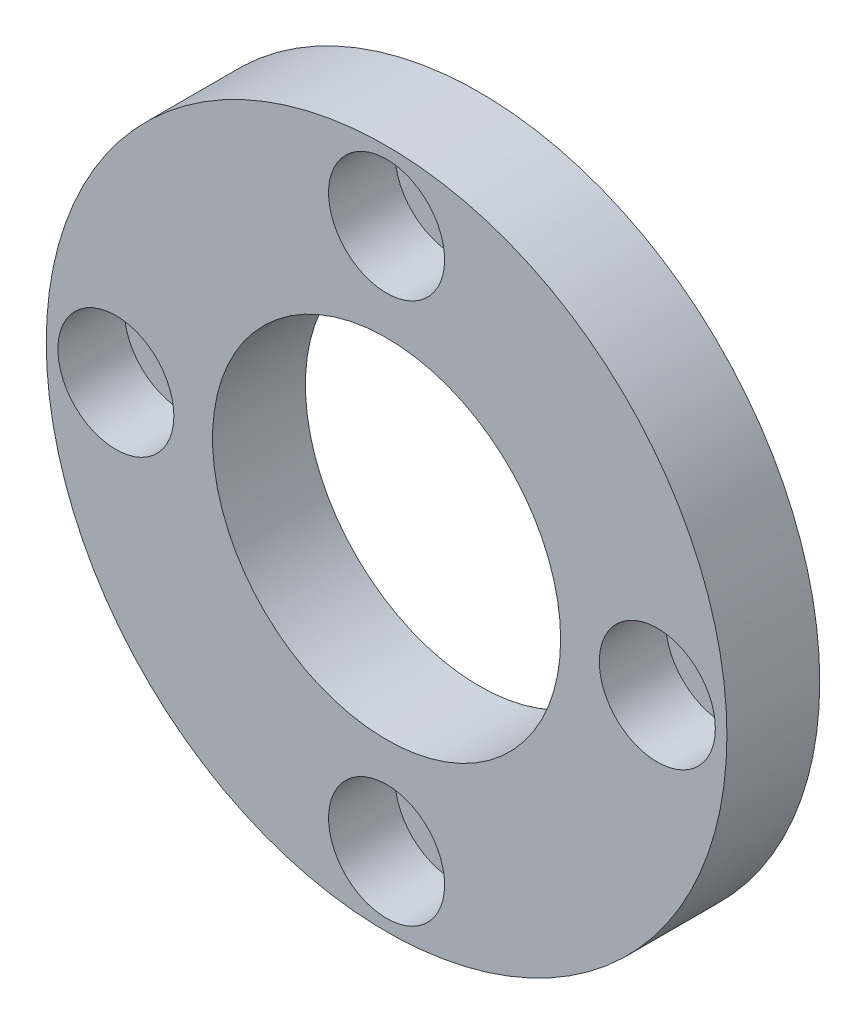
ISO-10303-21;
HEADER;
FILE_DESCRIPTION(('STEP AP214'),'2;1');
FILE_NAME('part.step','',(''),(''),'','','');
FILE_SCHEMA(('AUTOMOTIVE_DESIGN { 1 0 10303 214 1 1 1 1 }'));
ENDSEC;
DATA;
#1=APPLICATION_CONTEXT('core data for automotive mechanical design processes');
#2=APPLICATION_PROTOCOL_DEFINITION('international standard','automotive_design',2000,#1);
#3=PRODUCT_CONTEXT('',#1,'mechanical');
#4=PRODUCT('Part','Part','',(#3));
#5=PRODUCT_RELATED_PRODUCT_CATEGORY('part','',(#4));
#6=PRODUCT_DEFINITION_FORMATION('','',#4);
#7=PRODUCT_DEFINITION_CONTEXT('part definition',#1,'design');
#8=PRODUCT_DEFINITION('design','',#6,#7);
#9=PRODUCT_DEFINITION_SHAPE('','',#8);
#10=(LENGTH_UNIT() NAMED_UNIT(*) SI_UNIT(.MILLI.,.METRE.));
#11=(NAMED_UNIT(*) PLANE_ANGLE_UNIT() SI_UNIT($,.RADIAN.));
#12=(NAMED_UNIT(*) SI_UNIT($,.STERADIAN.) SOLID_ANGLE_UNIT());
#13=UNCERTAINTY_MEASURE_WITH_UNIT(LENGTH_MEASURE(1.E-05),#10,'distance_accuracy_value','');
#14=(GEOMETRIC_REPRESENTATION_CONTEXT(3) GLOBAL_UNCERTAINTY_ASSIGNED_CONTEXT((#13)) GLOBAL_UNIT_ASSIGNED_CONTEXT((#10,
#11,#12)) REPRESENTATION_CONTEXT('',''));
#15=CARTESIAN_POINT('',(0.,0.,0.));
#16=DIRECTION('',(0.,0.,1.));
#17=DIRECTION('',(1.,0.,0.));
#18=AXIS2_PLACEMENT_3D('',#15,#16,#17);
#19=CARTESIAN_POINT('',(0.,0.,12.));
#20=DIRECTION('',(0.,0.,1.));
#21=DIRECTION('',(1.,0.,0.));
#22=AXIS2_PLACEMENT_3D('',#19,#20,#21);
#23=PLANE('',#22);
#24=CARTESIAN_POINT('',(0.,-34.9999999999995,12.));
#25=DIRECTION('',(0.,0.,1.));
#26=DIRECTION('',(1.,0.,0.));
#27=AXIS2_PLACEMENT_3D('',#24,#25,#26);
#28=CIRCLE('',#27,7.5);
#29=CARTESIAN_POINT('',(7.50000000000006,-34.9999999999995,12.));
#30=VERTEX_POINT('',#29);
#31=EDGE_CURVE('E121',#30,#30,#28,.T.);
#32=ORIENTED_EDGE('',*,*,#31,.F.);
#33=EDGE_LOOP('',(#32));
#34=FACE_BOUND('',#33,.T.);
#35=CARTESIAN_POINT('',(-34.9999999999999,0.,12.));
#36=DIRECTION('',(0.,0.,1.));
#37=DIRECTION('',(1.,0.,0.));
#38=AXIS2_PLACEMENT_3D('',#35,#36,#37);
#39=CIRCLE('',#38,7.5);
#40=CARTESIAN_POINT('',(-27.4999999999999,0.,12.));
#41=VERTEX_POINT('',#40);
#42=EDGE_CURVE('E77',#41,#41,#39,.T.);
#43=ORIENTED_EDGE('',*,*,#42,.F.);
#44=EDGE_LOOP('',(#43));
#45=FACE_BOUND('',#44,.T.);
#46=CARTESIAN_POINT('',(0.,35.0000000000005,12.));
#47=DIRECTION('',(0.,0.,1.));
#48=DIRECTION('',(1.,0.,0.));
#49=AXIS2_PLACEMENT_3D('',#46,#47,#48);
#50=CIRCLE('',#49,7.5);
#51=CARTESIAN_POINT('',(7.50000000000006,35.0000000000005,12.));
#52=VERTEX_POINT('',#51);
#53=EDGE_CURVE('E64',#52,#52,#50,.T.);
#54=ORIENTED_EDGE('',*,*,#53,.F.);
#55=EDGE_LOOP('',(#54));
#56=FACE_BOUND('',#55,.T.);
#57=CARTESIAN_POINT('',(35.0000000000001,3.34151908649102E-13,12.));
#58=DIRECTION('',(0.,0.,1.));
#59=DIRECTION('',(1.,0.,0.));
#60=AXIS2_PLACEMENT_3D('',#57,#58,#59);
#61=CIRCLE('',#60,7.49999999999999);
#62=CARTESIAN_POINT('',(42.5000000000001,3.34151908649102E-13,12.));
#63=VERTEX_POINT('',#62);
#64=EDGE_CURVE('E60',#63,#63,#61,.T.);
#65=ORIENTED_EDGE('',*,*,#64,.F.);
#66=EDGE_LOOP('',(#65));
#67=FACE_BOUND('',#66,.T.);
#68=CARTESIAN_POINT('',(0.,0.,12.));
#69=DIRECTION('',(0.,0.,1.));
#70=DIRECTION('',(1.,0.,0.));
#71=AXIS2_PLACEMENT_3D('',#68,#69,#70);
#72=CIRCLE('',#71,44.);
#73=CARTESIAN_POINT('',(44.,0.,12.));
#74=VERTEX_POINT('',#73);
#75=EDGE_CURVE('E10',#74,#74,#72,.T.);
#76=ORIENTED_EDGE('',*,*,#75,.T.);
#77=EDGE_LOOP('',(#76));
#78=FACE_BOUND('',#77,.T.);
#79=CARTESIAN_POINT('',(0.,0.,12.));
#80=DIRECTION('',(0.,0.,1.));
#81=DIRECTION('',(1.,0.,0.));
#82=AXIS2_PLACEMENT_3D('',#79,#80,#81);
#83=CIRCLE('',#82,22.5);
#84=CARTESIAN_POINT('',(22.5,0.,12.));
#85=VERTEX_POINT('',#84);
#86=EDGE_CURVE('E48',#85,#85,#83,.T.);
#87=ORIENTED_EDGE('',*,*,#86,.F.);
#88=EDGE_LOOP('',(#87));
#89=FACE_BOUND('',#88,.T.);
#90=ADVANCED_FACE('F35',(#34,#45,#56,#67,#78,#89),#23,.T.);
#91=CARTESIAN_POINT('',(0.,0.,0.));
#92=DIRECTION('',(0.,0.,1.));
#93=DIRECTION('',(1.,0.,0.));
#94=AXIS2_PLACEMENT_3D('',#91,#92,#93);
#95=PLANE('',#94);
#96=CARTESIAN_POINT('',(0.,-34.9999999999995,0.));
#97=DIRECTION('',(0.,0.,1.));
#98=DIRECTION('',(1.,0.,0.));
#99=AXIS2_PLACEMENT_3D('',#96,#97,#98);
#100=CIRCLE('',#99,4.49999999999999);
#101=CARTESIAN_POINT('',(4.50000000000006,-34.9999999999995,0.));
#102=VERTEX_POINT('',#101);
#103=EDGE_CURVE('E39',#102,#102,#100,.T.);
#104=ORIENTED_EDGE('',*,*,#103,.T.);
#105=EDGE_LOOP('',(#104));
#106=FACE_BOUND('',#105,.T.);
#107=CARTESIAN_POINT('',(-34.9999999999999,0.,0.));
#108=DIRECTION('',(0.,0.,1.));
#109=DIRECTION('',(1.,0.,0.));
#110=AXIS2_PLACEMENT_3D('',#107,#108,#109);
#111=CIRCLE('',#110,4.5);
#112=CARTESIAN_POINT('',(-30.4999999999999,0.,0.));
#113=VERTEX_POINT('',#112);
#114=EDGE_CURVE('E62',#113,#113,#111,.T.);
#115=ORIENTED_EDGE('',*,*,#114,.T.);
#116=EDGE_LOOP('',(#115));
#117=FACE_BOUND('',#116,.T.);
#118=CARTESIAN_POINT('',(0.,35.0000000000005,0.));
#119=DIRECTION('',(0.,0.,1.));
#120=DIRECTION('',(1.,0.,0.));
#121=AXIS2_PLACEMENT_3D('',#118,#119,#120);
#122=CIRCLE('',#121,4.49999999999999);
#123=CARTESIAN_POINT('',(4.50000000000006,35.0000000000005,0.));
#124=VERTEX_POINT('',#123);
#125=EDGE_CURVE('E58',#124,#124,#122,.T.);
#126=ORIENTED_EDGE('',*,*,#125,.T.);
#127=EDGE_LOOP('',(#126));
#128=FACE_BOUND('',#127,.T.);
#129=CARTESIAN_POINT('',(35.0000000000001,3.34151908649102E-13,0.));
#130=DIRECTION('',(0.,0.,1.));
#131=DIRECTION('',(1.,0.,0.));
#132=AXIS2_PLACEMENT_3D('',#129,#130,#131);
#133=CIRCLE('',#132,4.49999999999999);
#134=CARTESIAN_POINT('',(39.5000000000001,3.34151908649102E-13,0.));
#135=VERTEX_POINT('',#134);
#136=EDGE_CURVE('E54',#135,#135,#133,.T.);
#137=ORIENTED_EDGE('',*,*,#136,.T.);
#138=EDGE_LOOP('',(#137));
#139=FACE_BOUND('',#138,.T.);
#140=CARTESIAN_POINT('',(0.,0.,0.));
#141=DIRECTION('',(0.,0.,1.));
#142=DIRECTION('',(1.,0.,0.));
#143=AXIS2_PLACEMENT_3D('',#140,#141,#142);
#144=CIRCLE('',#143,44.);
#145=CARTESIAN_POINT('',(44.,0.,0.));
#146=VERTEX_POINT('',#145);
#147=EDGE_CURVE('E43',#146,#146,#144,.T.);
#148=ORIENTED_EDGE('',*,*,#147,.F.);
#149=EDGE_LOOP('',(#148));
#150=FACE_BOUND('',#149,.T.);
#151=CARTESIAN_POINT('',(0.,0.,0.));
#152=DIRECTION('',(0.,0.,1.));
#153=DIRECTION('',(1.,0.,0.));
#154=AXIS2_PLACEMENT_3D('',#151,#152,#153);
#155=CIRCLE('',#154,22.5);
#156=CARTESIAN_POINT('',(22.5,0.,0.));
#157=VERTEX_POINT('',#156);
#158=EDGE_CURVE('E51',#157,#157,#155,.T.);
#159=ORIENTED_EDGE('',*,*,#158,.T.);
#160=EDGE_LOOP('',(#159));
#161=FACE_BOUND('',#160,.T.);
#162=ADVANCED_FACE('F97',(#106,#117,#128,#139,#150,#161),#95,.F.);
#163=CARTESIAN_POINT('',(0.,0.,12.));
#164=DIRECTION('',(0.,0.,-1.));
#165=DIRECTION('',(-1.,0.,0.));
#166=AXIS2_PLACEMENT_3D('',#163,#164,#165);
#167=CYLINDRICAL_SURFACE('',#166,44.);
#168=ORIENTED_EDGE('',*,*,#75,.F.);
#169=EDGE_LOOP('',(#168));
#170=FACE_BOUND('',#169,.T.);
#171=ORIENTED_EDGE('',*,*,#147,.T.);
#172=EDGE_LOOP('',(#171));
#173=FACE_BOUND('',#172,.T.);
#174=ADVANCED_FACE('F37',(#170,#173),#167,.T.);
#175=CARTESIAN_POINT('',(0.,0.,12.));
#176=DIRECTION('',(0.,0.,-1.));
#177=DIRECTION('',(-1.,0.,0.));
#178=AXIS2_PLACEMENT_3D('',#175,#176,#177);
#179=CYLINDRICAL_SURFACE('',#178,22.5);
#180=ORIENTED_EDGE('',*,*,#86,.T.);
#181=EDGE_LOOP('',(#180));
#182=FACE_BOUND('',#181,.T.);
#183=ORIENTED_EDGE('',*,*,#158,.F.);
#184=EDGE_LOOP('',(#183));
#185=FACE_BOUND('',#184,.T.);
#186=ADVANCED_FACE('F99',(#182,#185),#179,.F.);
#187=CARTESIAN_POINT('',(35.0000000000001,3.34151908649102E-13,12.));
#188=DIRECTION('',(0.,0.,1.));
#189=DIRECTION('',(1.,0.,0.));
#190=AXIS2_PLACEMENT_3D('',#187,#188,#189);
#191=CYLINDRICAL_SURFACE('',#190,4.49999999999999);
#192=CARTESIAN_POINT('',(35.0000000000001,3.34151908649102E-13,3.4));
#193=DIRECTION('',(0.,0.,1.));
#194=DIRECTION('',(1.,0.,0.));
#195=AXIS2_PLACEMENT_3D('',#192,#193,#194);
#196=CIRCLE('',#195,4.5);
#197=CARTESIAN_POINT('',(39.5000000000001,3.34151908649102E-13,3.4));
#198=VERTEX_POINT('',#197);
#199=EDGE_CURVE('E57',#198,#198,#196,.T.);
#200=ORIENTED_EDGE('',*,*,#199,.T.);
#201=EDGE_LOOP('',(#200));
#202=FACE_BOUND('',#201,.T.);
#203=ORIENTED_EDGE('',*,*,#136,.F.);
#204=EDGE_LOOP('',(#203));
#205=FACE_BOUND('',#204,.T.);
#206=ADVANCED_FACE('F101',(#202,#205),#191,.F.);
#207=CARTESIAN_POINT('',(39.5000000000001,3.34151908649102E-13,3.4));
#208=DIRECTION('',(0.,0.,-1.));
#209=DIRECTION('',(-1.,0.,0.));
#210=AXIS2_PLACEMENT_3D('',#207,#208,#209);
#211=PLANE('',#210);
#212=ORIENTED_EDGE('',*,*,#199,.F.);
#213=EDGE_LOOP('',(#212));
#214=FACE_BOUND('',#213,.T.);
#215=CARTESIAN_POINT('',(35.0000000000001,3.34151908649102E-13,3.4));
#216=DIRECTION('',(0.,0.,1.));
#217=DIRECTION('',(1.,0.,0.));
#218=AXIS2_PLACEMENT_3D('',#215,#216,#217);
#219=CIRCLE('',#218,7.49999999999999);
#220=CARTESIAN_POINT('',(42.5000000000001,3.34151908649102E-13,3.4));
#221=VERTEX_POINT('',#220);
#222=EDGE_CURVE('E87',#221,#221,#219,.T.);
#223=ORIENTED_EDGE('',*,*,#222,.T.);
#224=EDGE_LOOP('',(#223));
#225=FACE_BOUND('',#224,.T.);
#226=ADVANCED_FACE('F107',(#214,#225),#211,.F.);
#227=CARTESIAN_POINT('',(35.0000000000001,3.34151908649102E-13,12.));
#228=DIRECTION('',(0.,0.,1.));
#229=DIRECTION('',(1.,0.,0.));
#230=AXIS2_PLACEMENT_3D('',#227,#228,#229);
#231=CYLINDRICAL_SURFACE('',#230,7.49999999999999);
#232=ORIENTED_EDGE('',*,*,#222,.F.);
#233=EDGE_LOOP('',(#232));
#234=FACE_BOUND('',#233,.T.);
#235=ORIENTED_EDGE('',*,*,#64,.T.);
#236=EDGE_LOOP('',(#235));
#237=FACE_BOUND('',#236,.T.);
#238=ADVANCED_FACE('F130',(#234,#237),#231,.F.);
#239=CARTESIAN_POINT('',(0.,35.0000000000005,12.));
#240=DIRECTION('',(0.,0.,1.));
#241=DIRECTION('',(1.,0.,0.));
#242=AXIS2_PLACEMENT_3D('',#239,#240,#241);
#243=CYLINDRICAL_SURFACE('',#242,4.49999999999999);
#244=CARTESIAN_POINT('',(0.,35.0000000000005,3.4));
#245=DIRECTION('',(0.,0.,1.));
#246=DIRECTION('',(1.,0.,0.));
#247=AXIS2_PLACEMENT_3D('',#244,#245,#246);
#248=CIRCLE('',#247,4.5);
#249=CARTESIAN_POINT('',(4.50000000000006,35.0000000000005,3.4));
#250=VERTEX_POINT('',#249);
#251=EDGE_CURVE('E61',#250,#250,#248,.T.);
#252=ORIENTED_EDGE('',*,*,#251,.T.);
#253=EDGE_LOOP('',(#252));
#254=FACE_BOUND('',#253,.T.);
#255=ORIENTED_EDGE('',*,*,#125,.F.);
#256=EDGE_LOOP('',(#255));
#257=FACE_BOUND('',#256,.T.);
#258=ADVANCED_FACE('F132',(#254,#257),#243,.F.);
#259=CARTESIAN_POINT('',(4.50000000000006,35.0000000000005,3.4));
#260=DIRECTION('',(0.,0.,-1.));
#261=DIRECTION('',(-1.,0.,0.));
#262=AXIS2_PLACEMENT_3D('',#259,#260,#261);
#263=PLANE('',#262);
#264=ORIENTED_EDGE('',*,*,#251,.F.);
#265=EDGE_LOOP('',(#264));
#266=FACE_BOUND('',#265,.T.);
#267=CARTESIAN_POINT('',(0.,35.0000000000005,3.4));
#268=DIRECTION('',(0.,0.,1.));
#269=DIRECTION('',(1.,0.,0.));
#270=AXIS2_PLACEMENT_3D('',#267,#268,#269);
#271=CIRCLE('',#270,7.5);
#272=CARTESIAN_POINT('',(7.50000000000006,35.0000000000005,3.4));
#273=VERTEX_POINT('',#272);
#274=EDGE_CURVE('E69',#273,#273,#271,.T.);
#275=ORIENTED_EDGE('',*,*,#274,.T.);
#276=EDGE_LOOP('',(#275));
#277=FACE_BOUND('',#276,.T.);
#278=ADVANCED_FACE('F139',(#266,#277),#263,.F.);
#279=CARTESIAN_POINT('',(0.,35.0000000000005,12.));
#280=DIRECTION('',(0.,0.,1.));
#281=DIRECTION('',(1.,0.,0.));
#282=AXIS2_PLACEMENT_3D('',#279,#280,#281);
#283=CYLINDRICAL_SURFACE('',#282,7.5);
#284=ORIENTED_EDGE('',*,*,#274,.F.);
#285=EDGE_LOOP('',(#284));
#286=FACE_BOUND('',#285,.T.);
#287=ORIENTED_EDGE('',*,*,#53,.T.);
#288=EDGE_LOOP('',(#287));
#289=FACE_BOUND('',#288,.T.);
#290=ADVANCED_FACE('F148',(#286,#289),#283,.F.);
#291=CARTESIAN_POINT('',(-34.9999999999999,0.,12.));
#292=DIRECTION('',(0.,0.,1.));
#293=DIRECTION('',(1.,0.,0.));
#294=AXIS2_PLACEMENT_3D('',#291,#292,#293);
#295=CYLINDRICAL_SURFACE('',#294,4.5);
#296=CARTESIAN_POINT('',(-34.9999999999999,0.,3.4));
#297=DIRECTION('',(0.,0.,1.));
#298=DIRECTION('',(1.,0.,0.));
#299=AXIS2_PLACEMENT_3D('',#296,#297,#298);
#300=CIRCLE('',#299,4.5);
#301=CARTESIAN_POINT('',(-30.4999999999999,0.,3.4));
#302=VERTEX_POINT('',#301);
#303=EDGE_CURVE('E65',#302,#302,#300,.T.);
#304=ORIENTED_EDGE('',*,*,#303,.T.);
#305=EDGE_LOOP('',(#304));
#306=FACE_BOUND('',#305,.T.);
#307=ORIENTED_EDGE('',*,*,#114,.F.);
#308=EDGE_LOOP('',(#307));
#309=FACE_BOUND('',#308,.T.);
#310=ADVANCED_FACE('F152',(#306,#309),#295,.F.);
#311=CARTESIAN_POINT('',(-30.4999999999999,0.,3.4));
#312=DIRECTION('',(0.,0.,-1.));
#313=DIRECTION('',(-1.,0.,0.));
#314=AXIS2_PLACEMENT_3D('',#311,#312,#313);
#315=PLANE('',#314);
#316=ORIENTED_EDGE('',*,*,#303,.F.);
#317=EDGE_LOOP('',(#316));
#318=FACE_BOUND('',#317,.T.);
#319=CARTESIAN_POINT('',(-34.9999999999999,0.,3.4));
#320=DIRECTION('',(0.,0.,1.));
#321=DIRECTION('',(1.,0.,0.));
#322=AXIS2_PLACEMENT_3D('',#319,#320,#321);
#323=CIRCLE('',#322,7.5);
#324=CARTESIAN_POINT('',(-27.4999999999999,0.,3.4));
#325=VERTEX_POINT('',#324);
#326=EDGE_CURVE('E72',#325,#325,#323,.T.);
#327=ORIENTED_EDGE('',*,*,#326,.T.);
#328=EDGE_LOOP('',(#327));
#329=FACE_BOUND('',#328,.T.);
#330=ADVANCED_FACE('F156',(#318,#329),#315,.F.);
#331=CARTESIAN_POINT('',(-34.9999999999999,0.,12.));
#332=DIRECTION('',(0.,0.,1.));
#333=DIRECTION('',(1.,0.,0.));
#334=AXIS2_PLACEMENT_3D('',#331,#332,#333);
#335=CYLINDRICAL_SURFACE('',#334,7.5);
#336=ORIENTED_EDGE('',*,*,#326,.F.);
#337=EDGE_LOOP('',(#336));
#338=FACE_BOUND('',#337,.T.);
#339=ORIENTED_EDGE('',*,*,#42,.T.);
#340=EDGE_LOOP('',(#339));
#341=FACE_BOUND('',#340,.T.);
#342=ADVANCED_FACE('F159',(#338,#341),#335,.F.);
#343=CARTESIAN_POINT('',(0.,-34.9999999999995,12.));
#344=DIRECTION('',(0.,0.,1.));
#345=DIRECTION('',(1.,0.,0.));
#346=AXIS2_PLACEMENT_3D('',#343,#344,#345);
#347=CYLINDRICAL_SURFACE('',#346,4.49999999999999);
#348=CARTESIAN_POINT('',(0.,-34.9999999999995,3.4));
#349=DIRECTION('',(0.,0.,1.));
#350=DIRECTION('',(1.,0.,0.));
#351=AXIS2_PLACEMENT_3D('',#348,#349,#350);
#352=CIRCLE('',#351,4.5);
#353=CARTESIAN_POINT('',(4.50000000000006,-34.9999999999995,3.4));
#354=VERTEX_POINT('',#353);
#355=EDGE_CURVE('E182',#354,#354,#352,.T.);
#356=ORIENTED_EDGE('',*,*,#355,.T.);
#357=EDGE_LOOP('',(#356));
#358=FACE_BOUND('',#357,.T.);
#359=ORIENTED_EDGE('',*,*,#103,.F.);
#360=EDGE_LOOP('',(#359));
#361=FACE_BOUND('',#360,.T.);
#362=ADVANCED_FACE('F163',(#358,#361),#347,.F.);
#363=CARTESIAN_POINT('',(4.50000000000006,-34.9999999999995,3.4));
#364=DIRECTION('',(0.,0.,-1.));
#365=DIRECTION('',(-1.,0.,0.));
#366=AXIS2_PLACEMENT_3D('',#363,#364,#365);
#367=PLANE('',#366);
#368=ORIENTED_EDGE('',*,*,#355,.F.);
#369=EDGE_LOOP('',(#368));
#370=FACE_BOUND('',#369,.T.);
#371=CARTESIAN_POINT('',(0.,-34.9999999999995,3.4));
#372=DIRECTION('',(0.,0.,1.));
#373=DIRECTION('',(1.,0.,0.));
#374=AXIS2_PLACEMENT_3D('',#371,#372,#373);
#375=CIRCLE('',#374,7.5);
#376=CARTESIAN_POINT('',(7.50000000000006,-34.9999999999995,3.4));
#377=VERTEX_POINT('',#376);
#378=EDGE_CURVE('E180',#377,#377,#375,.T.);
#379=ORIENTED_EDGE('',*,*,#378,.T.);
#380=EDGE_LOOP('',(#379));
#381=FACE_BOUND('',#380,.T.);
#382=ADVANCED_FACE('F167',(#370,#381),#367,.F.);
#383=CARTESIAN_POINT('',(0.,-34.9999999999995,12.));
#384=DIRECTION('',(0.,0.,1.));
#385=DIRECTION('',(1.,0.,0.));
#386=AXIS2_PLACEMENT_3D('',#383,#384,#385);
#387=CYLINDRICAL_SURFACE('',#386,7.5);
#388=ORIENTED_EDGE('',*,*,#378,.F.);
#389=EDGE_LOOP('',(#388));
#390=FACE_BOUND('',#389,.T.);
#391=ORIENTED_EDGE('',*,*,#31,.T.);
#392=EDGE_LOOP('',(#391));
#393=FACE_BOUND('',#392,.T.);
#394=ADVANCED_FACE('F171',(#390,#393),#387,.F.);
#395=CLOSED_SHELL('',(#90,#162,#174,#186,#206,#226,#238,#258,#278,#290,#310,#330,#342,#362,#382,#394));
#396=MANIFOLD_SOLID_BREP('B2',#395);
#397=ADVANCED_BREP_SHAPE_REPRESENTATION('',(#18,#396),#14);
#398=SHAPE_DEFINITION_REPRESENTATION(#9,#397);
ENDSEC;
END-ISO-10303-21;
